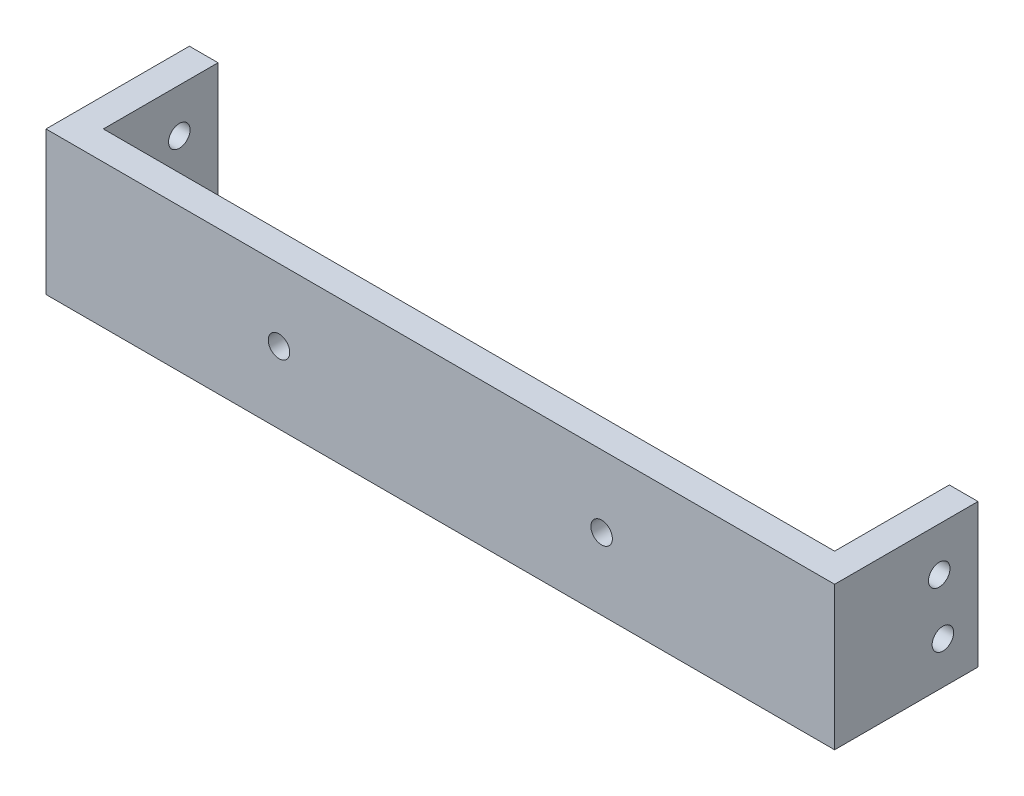
ISO-10303-21;
HEADER;
FILE_DESCRIPTION(('STEP AP214'),'2;1');
FILE_NAME('part.step','',(''),(''),'','','');
FILE_SCHEMA(('AUTOMOTIVE_DESIGN { 1 0 10303 214 1 1 1 1 }'));
ENDSEC;
DATA;
#1=APPLICATION_CONTEXT('core data for automotive mechanical design processes');
#2=APPLICATION_PROTOCOL_DEFINITION('international standard','automotive_design',2000,#1);
#3=PRODUCT_CONTEXT('',#1,'mechanical');
#4=PRODUCT('Part','Part','',(#3));
#5=PRODUCT_RELATED_PRODUCT_CATEGORY('part','',(#4));
#6=PRODUCT_DEFINITION_FORMATION('','',#4);
#7=PRODUCT_DEFINITION_CONTEXT('part definition',#1,'design');
#8=PRODUCT_DEFINITION('design','',#6,#7);
#9=PRODUCT_DEFINITION_SHAPE('','',#8);
#10=(LENGTH_UNIT() NAMED_UNIT(*) SI_UNIT(.MILLI.,.METRE.));
#11=(NAMED_UNIT(*) PLANE_ANGLE_UNIT() SI_UNIT($,.RADIAN.));
#12=(NAMED_UNIT(*) SI_UNIT($,.STERADIAN.) SOLID_ANGLE_UNIT());
#13=UNCERTAINTY_MEASURE_WITH_UNIT(LENGTH_MEASURE(1.E-05),#10,'distance_accuracy_value','');
#14=(GEOMETRIC_REPRESENTATION_CONTEXT(3) GLOBAL_UNCERTAINTY_ASSIGNED_CONTEXT((#13)) GLOBAL_UNIT_ASSIGNED_CONTEXT((#10,
#11,#12)) REPRESENTATION_CONTEXT('',''));
#15=CARTESIAN_POINT('',(0.,0.,0.));
#16=DIRECTION('',(0.,0.,1.));
#17=DIRECTION('',(1.,0.,0.));
#18=AXIS2_PLACEMENT_3D('',#15,#16,#17);
#19=CARTESIAN_POINT('',(55.,20.,0.));
#20=DIRECTION('',(1.,0.,0.));
#21=DIRECTION('',(0.,0.,-1.));
#22=AXIS2_PLACEMENT_3D('',#19,#20,#21);
#23=PLANE('',#22);
#24=CARTESIAN_POINT('',(55.,13.8673052898988,-12.5936105145427));
#25=DIRECTION('',(1.,0.,0.));
#26=DIRECTION('',(0.,0.,-1.));
#27=AXIS2_PLACEMENT_3D('',#24,#25,#26);
#28=CIRCLE('',#27,1.5);
#29=CARTESIAN_POINT('',(55.,13.8673052898988,-14.0936105145427));
#30=VERTEX_POINT('',#29);
#31=EDGE_CURVE('E198',#30,#30,#28,.T.);
#32=ORIENTED_EDGE('',*,*,#31,.F.);
#33=EDGE_LOOP('',(#32));
#34=FACE_BOUND('',#33,.T.);
#35=CARTESIAN_POINT('',(55.,5.88298190514036,-13.1039878477571));
#36=DIRECTION('',(1.,0.,0.));
#37=DIRECTION('',(0.,0.,-1.));
#38=AXIS2_PLACEMENT_3D('',#35,#36,#37);
#39=CIRCLE('',#38,1.5);
#40=CARTESIAN_POINT('',(55.,5.88298190514036,-14.6039878477571));
#41=VERTEX_POINT('',#40);
#42=EDGE_CURVE('E191',#41,#41,#39,.T.);
#43=ORIENTED_EDGE('',*,*,#42,.F.);
#44=EDGE_LOOP('',(#43));
#45=FACE_BOUND('',#44,.T.);
#46=DIRECTION('',(0.,0.,1.));
#47=VECTOR('',#46,1.);
#48=CARTESIAN_POINT('',(55.,0.,0.));
#49=LINE('',#48,#47);
#50=CARTESIAN_POINT('',(55.,0.,-18.));
#51=VERTEX_POINT('',#50);
#52=CARTESIAN_POINT('',(55.,0.,2.));
#53=VERTEX_POINT('',#52);
#54=EDGE_CURVE('E130',#51,#53,#49,.T.);
#55=ORIENTED_EDGE('',*,*,#54,.F.);
#56=DIRECTION('',(0.,-1.,0.));
#57=VECTOR('',#56,1.);
#58=CARTESIAN_POINT('',(55.,20.,-18.));
#59=LINE('',#58,#57);
#60=CARTESIAN_POINT('',(55.,20.,-18.));
#61=VERTEX_POINT('',#60);
#62=EDGE_CURVE('E11',#61,#51,#59,.T.);
#63=ORIENTED_EDGE('',*,*,#62,.F.);
#64=DIRECTION('',(0.,0.,1.));
#65=VECTOR('',#64,1.);
#66=CARTESIAN_POINT('',(55.,20.,0.));
#67=LINE('',#66,#65);
#68=CARTESIAN_POINT('',(55.,20.,2.));
#69=VERTEX_POINT('',#68);
#70=EDGE_CURVE('E150',#61,#69,#67,.T.);
#71=ORIENTED_EDGE('',*,*,#70,.T.);
#72=DIRECTION('',(0.,-1.,0.));
#73=VECTOR('',#72,1.);
#74=CARTESIAN_POINT('',(55.,20.,2.));
#75=LINE('',#74,#73);
#76=EDGE_CURVE('E85',#69,#53,#75,.T.);
#77=ORIENTED_EDGE('',*,*,#76,.T.);
#78=EDGE_LOOP('',(#55,#63,#71,#77));
#79=FACE_BOUND('',#78,.T.);
#80=ADVANCED_FACE('F35',(#34,#45,#79),#23,.T.);
#81=CARTESIAN_POINT('',(0.,20.,-18.));
#82=DIRECTION('',(0.,0.,1.));
#83=DIRECTION('',(1.,0.,0.));
#84=AXIS2_PLACEMENT_3D('',#81,#82,#83);
#85=PLANE('',#84);
#86=DIRECTION('',(-1.,0.,0.));
#87=VECTOR('',#86,1.);
#88=CARTESIAN_POINT('',(0.,0.,-18.));
#89=LINE('',#88,#87);
#90=CARTESIAN_POINT('',(51.,0.,-18.));
#91=VERTEX_POINT('',#90);
#92=EDGE_CURVE('E133',#51,#91,#89,.T.);
#93=ORIENTED_EDGE('',*,*,#92,.T.);
#94=DIRECTION('',(0.,-1.,0.));
#95=VECTOR('',#94,1.);
#96=CARTESIAN_POINT('',(51.,20.,-18.));
#97=LINE('',#96,#95);
#98=CARTESIAN_POINT('',(51.,20.,-18.));
#99=VERTEX_POINT('',#98);
#100=EDGE_CURVE('E43',#99,#91,#97,.T.);
#101=ORIENTED_EDGE('',*,*,#100,.F.);
#102=DIRECTION('',(-1.,0.,0.));
#103=VECTOR('',#102,1.);
#104=CARTESIAN_POINT('',(0.,20.,-18.));
#105=LINE('',#104,#103);
#106=EDGE_CURVE('E174',#61,#99,#105,.T.);
#107=ORIENTED_EDGE('',*,*,#106,.F.);
#108=ORIENTED_EDGE('',*,*,#62,.T.);
#109=EDGE_LOOP('',(#93,#101,#107,#108));
#110=FACE_BOUND('',#109,.T.);
#111=ADVANCED_FACE('F166',(#110),#85,.F.);
#112=CARTESIAN_POINT('',(51.,20.,0.));
#113=DIRECTION('',(-1.,0.,0.));
#114=DIRECTION('',(0.,0.,1.));
#115=AXIS2_PLACEMENT_3D('',#112,#113,#114);
#116=PLANE('',#115);
#117=CARTESIAN_POINT('',(51.,13.8673052898988,-12.5936105145427));
#118=DIRECTION('',(-1.,0.,0.));
#119=DIRECTION('',(0.,0.,1.));
#120=AXIS2_PLACEMENT_3D('',#117,#118,#119);
#121=CIRCLE('',#120,1.5);
#122=CARTESIAN_POINT('',(51.,13.8673052898988,-11.0936105145427));
#123=VERTEX_POINT('',#122);
#124=EDGE_CURVE('E134',#123,#123,#121,.T.);
#125=ORIENTED_EDGE('',*,*,#124,.F.);
#126=EDGE_LOOP('',(#125));
#127=FACE_BOUND('',#126,.T.);
#128=CARTESIAN_POINT('',(51.,5.88298190514036,-13.1039878477571));
#129=DIRECTION('',(-1.,0.,0.));
#130=DIRECTION('',(0.,0.,1.));
#131=AXIS2_PLACEMENT_3D('',#128,#129,#130);
#132=CIRCLE('',#131,1.5);
#133=CARTESIAN_POINT('',(51.,5.88298190514036,-11.6039878477571));
#134=VERTEX_POINT('',#133);
#135=EDGE_CURVE('E184',#134,#134,#132,.T.);
#136=ORIENTED_EDGE('',*,*,#135,.F.);
#137=EDGE_LOOP('',(#136));
#138=FACE_BOUND('',#137,.T.);
#139=DIRECTION('',(0.,0.,-1.));
#140=VECTOR('',#139,1.);
#141=CARTESIAN_POINT('',(51.,0.,0.));
#142=LINE('',#141,#140);
#143=CARTESIAN_POINT('',(51.,0.,-2.));
#144=VERTEX_POINT('',#143);
#145=EDGE_CURVE('E137',#144,#91,#142,.T.);
#146=ORIENTED_EDGE('',*,*,#145,.F.);
#147=DIRECTION('',(0.,-1.,0.));
#148=VECTOR('',#147,1.);
#149=CARTESIAN_POINT('',(51.,20.,-2.));
#150=LINE('',#149,#148);
#151=CARTESIAN_POINT('',(51.,20.,-2.));
#152=VERTEX_POINT('',#151);
#153=EDGE_CURVE('E156',#152,#144,#150,.T.);
#154=ORIENTED_EDGE('',*,*,#153,.F.);
#155=DIRECTION('',(0.,0.,-1.));
#156=VECTOR('',#155,1.);
#157=CARTESIAN_POINT('',(51.,20.,0.));
#158=LINE('',#157,#156);
#159=EDGE_CURVE('E163',#152,#99,#158,.T.);
#160=ORIENTED_EDGE('',*,*,#159,.T.);
#161=ORIENTED_EDGE('',*,*,#100,.T.);
#162=EDGE_LOOP('',(#146,#154,#160,#161));
#163=FACE_BOUND('',#162,.T.);
#164=ADVANCED_FACE('F161',(#127,#138,#163),#116,.T.);
#165=CARTESIAN_POINT('',(0.,20.,-2.));
#166=DIRECTION('',(0.,0.,-1.));
#167=DIRECTION('',(-1.,0.,0.));
#168=AXIS2_PLACEMENT_3D('',#165,#166,#167);
#169=PLANE('',#168);
#170=CARTESIAN_POINT('',(22.5,10.,-2.));
#171=DIRECTION('',(0.,0.,-1.));
#172=DIRECTION('',(-1.,0.,0.));
#173=AXIS2_PLACEMENT_3D('',#170,#171,#172);
#174=CIRCLE('',#173,1.5);
#175=CARTESIAN_POINT('',(21.,10.,-2.));
#176=VERTEX_POINT('',#175);
#177=EDGE_CURVE('E195',#176,#176,#174,.T.);
#178=ORIENTED_EDGE('',*,*,#177,.F.);
#179=EDGE_LOOP('',(#178));
#180=FACE_BOUND('',#179,.T.);
#181=CARTESIAN_POINT('',(-22.5,10.,-2.));
#182=DIRECTION('',(0.,0.,-1.));
#183=DIRECTION('',(-1.,0.,0.));
#184=AXIS2_PLACEMENT_3D('',#181,#182,#183);
#185=CIRCLE('',#184,1.5);
#186=CARTESIAN_POINT('',(-24.,10.,-2.));
#187=VERTEX_POINT('',#186);
#188=EDGE_CURVE('E205',#187,#187,#185,.T.);
#189=ORIENTED_EDGE('',*,*,#188,.F.);
#190=EDGE_LOOP('',(#189));
#191=FACE_BOUND('',#190,.T.);
#192=DIRECTION('',(1.,0.,0.));
#193=VECTOR('',#192,1.);
#194=CARTESIAN_POINT('',(0.,0.,-2.));
#195=LINE('',#194,#193);
#196=CARTESIAN_POINT('',(-51.,0.,-2.));
#197=VERTEX_POINT('',#196);
#198=EDGE_CURVE('E140',#197,#144,#195,.T.);
#199=ORIENTED_EDGE('',*,*,#198,.F.);
#200=DIRECTION('',(0.,-1.,0.));
#201=VECTOR('',#200,1.);
#202=CARTESIAN_POINT('',(-51.,20.,-2.));
#203=LINE('',#202,#201);
#204=CARTESIAN_POINT('',(-51.,20.,-2.));
#205=VERTEX_POINT('',#204);
#206=EDGE_CURVE('E154',#205,#197,#203,.T.);
#207=ORIENTED_EDGE('',*,*,#206,.F.);
#208=DIRECTION('',(1.,0.,0.));
#209=VECTOR('',#208,1.);
#210=CARTESIAN_POINT('',(0.,20.,-2.));
#211=LINE('',#210,#209);
#212=EDGE_CURVE('E125',#205,#152,#211,.T.);
#213=ORIENTED_EDGE('',*,*,#212,.T.);
#214=ORIENTED_EDGE('',*,*,#153,.T.);
#215=EDGE_LOOP('',(#199,#207,#213,#214));
#216=FACE_BOUND('',#215,.T.);
#217=ADVANCED_FACE('F172',(#180,#191,#216),#169,.T.);
#218=CARTESIAN_POINT('',(-51.,20.,0.));
#219=DIRECTION('',(-1.,0.,0.));
#220=DIRECTION('',(0.,0.,1.));
#221=AXIS2_PLACEMENT_3D('',#218,#219,#220);
#222=PLANE('',#221);
#223=CARTESIAN_POINT('',(-51.,13.8673052898988,-12.5936105145427));
#224=DIRECTION('',(-1.,0.,0.));
#225=DIRECTION('',(0.,0.,1.));
#226=AXIS2_PLACEMENT_3D('',#223,#224,#225);
#227=CIRCLE('',#226,1.5);
#228=CARTESIAN_POINT('',(-51.,13.8673052898988,-11.0936105145427));
#229=VERTEX_POINT('',#228);
#230=EDGE_CURVE('E181',#229,#229,#227,.T.);
#231=ORIENTED_EDGE('',*,*,#230,.T.);
#232=EDGE_LOOP('',(#231));
#233=FACE_BOUND('',#232,.T.);
#234=CARTESIAN_POINT('',(-51.,5.88298190514036,-13.1039878477571));
#235=DIRECTION('',(-1.,0.,0.));
#236=DIRECTION('',(0.,0.,1.));
#237=AXIS2_PLACEMENT_3D('',#234,#235,#236);
#238=CIRCLE('',#237,1.5);
#239=CARTESIAN_POINT('',(-51.,5.88298190514036,-11.6039878477571));
#240=VERTEX_POINT('',#239);
#241=EDGE_CURVE('E187',#240,#240,#238,.T.);
#242=ORIENTED_EDGE('',*,*,#241,.T.);
#243=EDGE_LOOP('',(#242));
#244=FACE_BOUND('',#243,.T.);
#245=DIRECTION('',(0.,0.,-1.));
#246=VECTOR('',#245,1.);
#247=CARTESIAN_POINT('',(-51.,0.,0.));
#248=LINE('',#247,#246);
#249=CARTESIAN_POINT('',(-51.,0.,-18.));
#250=VERTEX_POINT('',#249);
#251=EDGE_CURVE('E143',#197,#250,#248,.T.);
#252=ORIENTED_EDGE('',*,*,#251,.T.);
#253=DIRECTION('',(0.,-1.,0.));
#254=VECTOR('',#253,1.);
#255=CARTESIAN_POINT('',(-51.,20.,-18.));
#256=LINE('',#255,#254);
#257=CARTESIAN_POINT('',(-51.,20.,-18.));
#258=VERTEX_POINT('',#257);
#259=EDGE_CURVE('E113',#258,#250,#256,.T.);
#260=ORIENTED_EDGE('',*,*,#259,.F.);
#261=DIRECTION('',(0.,0.,-1.));
#262=VECTOR('',#261,1.);
#263=CARTESIAN_POINT('',(-51.,20.,0.));
#264=LINE('',#263,#262);
#265=EDGE_CURVE('E122',#205,#258,#264,.T.);
#266=ORIENTED_EDGE('',*,*,#265,.F.);
#267=ORIENTED_EDGE('',*,*,#206,.T.);
#268=EDGE_LOOP('',(#252,#260,#266,#267));
#269=FACE_BOUND('',#268,.T.);
#270=ADVANCED_FACE('F259',(#233,#244,#269),#222,.F.);
#271=CARTESIAN_POINT('',(0.,20.,-18.));
#272=DIRECTION('',(0.,0.,-1.));
#273=DIRECTION('',(-1.,0.,0.));
#274=AXIS2_PLACEMENT_3D('',#271,#272,#273);
#275=PLANE('',#274);
#276=DIRECTION('',(1.,0.,0.));
#277=VECTOR('',#276,1.);
#278=CARTESIAN_POINT('',(0.,0.,-18.));
#279=LINE('',#278,#277);
#280=CARTESIAN_POINT('',(-55.,0.,-18.));
#281=VERTEX_POINT('',#280);
#282=EDGE_CURVE('E112',#281,#250,#279,.T.);
#283=ORIENTED_EDGE('',*,*,#282,.F.);
#284=DIRECTION('',(0.,-1.,0.));
#285=VECTOR('',#284,1.);
#286=CARTESIAN_POINT('',(-55.,20.,-18.));
#287=LINE('',#286,#285);
#288=CARTESIAN_POINT('',(-55.,20.,-18.));
#289=VERTEX_POINT('',#288);
#290=EDGE_CURVE('E106',#289,#281,#287,.T.);
#291=ORIENTED_EDGE('',*,*,#290,.F.);
#292=DIRECTION('',(1.,0.,0.));
#293=VECTOR('',#292,1.);
#294=CARTESIAN_POINT('',(0.,20.,-18.));
#295=LINE('',#294,#293);
#296=EDGE_CURVE('E110',#289,#258,#295,.T.);
#297=ORIENTED_EDGE('',*,*,#296,.T.);
#298=ORIENTED_EDGE('',*,*,#259,.T.);
#299=EDGE_LOOP('',(#283,#291,#297,#298));
#300=FACE_BOUND('',#299,.T.);
#301=ADVANCED_FACE('F108',(#300),#275,.T.);
#302=CARTESIAN_POINT('',(-55.,20.,0.));
#303=DIRECTION('',(1.,0.,0.));
#304=DIRECTION('',(0.,0.,-1.));
#305=AXIS2_PLACEMENT_3D('',#302,#303,#304);
#306=PLANE('',#305);
#307=CARTESIAN_POINT('',(-55.,13.8673052898988,-12.5936105145427));
#308=DIRECTION('',(1.,0.,0.));
#309=DIRECTION('',(0.,0.,-1.));
#310=AXIS2_PLACEMENT_3D('',#307,#308,#309);
#311=CIRCLE('',#310,1.5);
#312=CARTESIAN_POINT('',(-55.,13.8673052898988,-14.0936105145427));
#313=VERTEX_POINT('',#312);
#314=EDGE_CURVE('E190',#313,#313,#311,.T.);
#315=ORIENTED_EDGE('',*,*,#314,.T.);
#316=EDGE_LOOP('',(#315));
#317=FACE_BOUND('',#316,.T.);
#318=CARTESIAN_POINT('',(-55.,5.88298190514036,-13.1039878477571));
#319=DIRECTION('',(1.,0.,0.));
#320=DIRECTION('',(0.,0.,-1.));
#321=AXIS2_PLACEMENT_3D('',#318,#319,#320);
#322=CIRCLE('',#321,1.5);
#323=CARTESIAN_POINT('',(-55.,5.88298190514036,-14.6039878477571));
#324=VERTEX_POINT('',#323);
#325=EDGE_CURVE('E194',#324,#324,#322,.T.);
#326=ORIENTED_EDGE('',*,*,#325,.T.);
#327=EDGE_LOOP('',(#326));
#328=FACE_BOUND('',#327,.T.);
#329=DIRECTION('',(0.,0.,1.));
#330=VECTOR('',#329,1.);
#331=CARTESIAN_POINT('',(-55.,0.,0.));
#332=LINE('',#331,#330);
#333=CARTESIAN_POINT('',(-55.,0.,2.));
#334=VERTEX_POINT('',#333);
#335=EDGE_CURVE('E78',#281,#334,#332,.T.);
#336=ORIENTED_EDGE('',*,*,#335,.T.);
#337=DIRECTION('',(0.,-1.,0.));
#338=VECTOR('',#337,1.);
#339=CARTESIAN_POINT('',(-55.,20.,2.));
#340=LINE('',#339,#338);
#341=CARTESIAN_POINT('',(-55.,20.,2.));
#342=VERTEX_POINT('',#341);
#343=EDGE_CURVE('E114',#342,#334,#340,.T.);
#344=ORIENTED_EDGE('',*,*,#343,.F.);
#345=DIRECTION('',(0.,0.,1.));
#346=VECTOR('',#345,1.);
#347=CARTESIAN_POINT('',(-55.,20.,0.));
#348=LINE('',#347,#346);
#349=EDGE_CURVE('E116',#289,#342,#348,.T.);
#350=ORIENTED_EDGE('',*,*,#349,.F.);
#351=ORIENTED_EDGE('',*,*,#290,.T.);
#352=EDGE_LOOP('',(#336,#344,#350,#351));
#353=FACE_BOUND('',#352,.T.);
#354=ADVANCED_FACE('F117',(#317,#328,#353),#306,.F.);
#355=CARTESIAN_POINT('',(0.,20.,2.));
#356=DIRECTION('',(0.,0.,-1.));
#357=DIRECTION('',(-1.,0.,0.));
#358=AXIS2_PLACEMENT_3D('',#355,#356,#357);
#359=PLANE('',#358);
#360=CARTESIAN_POINT('',(22.5,10.,2.));
#361=DIRECTION('',(0.,0.,1.));
#362=DIRECTION('',(1.,0.,0.));
#363=AXIS2_PLACEMENT_3D('',#360,#361,#362);
#364=CIRCLE('',#363,1.5);
#365=CARTESIAN_POINT('',(24.,10.,2.));
#366=VERTEX_POINT('',#365);
#367=EDGE_CURVE('E208',#366,#366,#364,.T.);
#368=ORIENTED_EDGE('',*,*,#367,.F.);
#369=EDGE_LOOP('',(#368));
#370=FACE_BOUND('',#369,.T.);
#371=CARTESIAN_POINT('',(-22.5,10.,2.));
#372=DIRECTION('',(0.,0.,1.));
#373=DIRECTION('',(1.,0.,0.));
#374=AXIS2_PLACEMENT_3D('',#371,#372,#373);
#375=CIRCLE('',#374,1.5);
#376=CARTESIAN_POINT('',(-21.,10.,2.));
#377=VERTEX_POINT('',#376);
#378=EDGE_CURVE('E209',#377,#377,#375,.T.);
#379=ORIENTED_EDGE('',*,*,#378,.F.);
#380=EDGE_LOOP('',(#379));
#381=FACE_BOUND('',#380,.T.);
#382=DIRECTION('',(1.,0.,0.));
#383=VECTOR('',#382,1.);
#384=CARTESIAN_POINT('',(0.,0.,2.));
#385=LINE('',#384,#383);
#386=EDGE_CURVE('E148',#334,#53,#385,.T.);
#387=ORIENTED_EDGE('',*,*,#386,.T.);
#388=ORIENTED_EDGE('',*,*,#76,.F.);
#389=DIRECTION('',(1.,0.,0.));
#390=VECTOR('',#389,1.);
#391=CARTESIAN_POINT('',(0.,20.,2.));
#392=LINE('',#391,#390);
#393=EDGE_CURVE('E51',#342,#69,#392,.T.);
#394=ORIENTED_EDGE('',*,*,#393,.F.);
#395=ORIENTED_EDGE('',*,*,#343,.T.);
#396=EDGE_LOOP('',(#387,#388,#394,#395));
#397=FACE_BOUND('',#396,.T.);
#398=ADVANCED_FACE('F217',(#370,#381,#397),#359,.F.);
#399=CARTESIAN_POINT('',(0.,20.,0.));
#400=DIRECTION('',(0.,1.,0.));
#401=DIRECTION('',(0.,0.,1.));
#402=AXIS2_PLACEMENT_3D('',#399,#400,#401);
#403=PLANE('',#402);
#404=ORIENTED_EDGE('',*,*,#70,.F.);
#405=ORIENTED_EDGE('',*,*,#106,.T.);
#406=ORIENTED_EDGE('',*,*,#159,.F.);
#407=ORIENTED_EDGE('',*,*,#212,.F.);
#408=ORIENTED_EDGE('',*,*,#265,.T.);
#409=ORIENTED_EDGE('',*,*,#296,.F.);
#410=ORIENTED_EDGE('',*,*,#349,.T.);
#411=ORIENTED_EDGE('',*,*,#393,.T.);
#412=EDGE_LOOP('',(#404,#405,#406,#407,#408,#409,#410,#411));
#413=FACE_BOUND('',#412,.T.);
#414=ADVANCED_FACE('F119',(#413),#403,.T.);
#415=CARTESIAN_POINT('',(0.,0.,0.));
#416=DIRECTION('',(0.,1.,0.));
#417=DIRECTION('',(0.,0.,1.));
#418=AXIS2_PLACEMENT_3D('',#415,#416,#417);
#419=PLANE('',#418);
#420=ORIENTED_EDGE('',*,*,#54,.T.);
#421=ORIENTED_EDGE('',*,*,#386,.F.);
#422=ORIENTED_EDGE('',*,*,#335,.F.);
#423=ORIENTED_EDGE('',*,*,#282,.T.);
#424=ORIENTED_EDGE('',*,*,#251,.F.);
#425=ORIENTED_EDGE('',*,*,#198,.T.);
#426=ORIENTED_EDGE('',*,*,#145,.T.);
#427=ORIENTED_EDGE('',*,*,#92,.F.);
#428=EDGE_LOOP('',(#420,#421,#422,#423,#424,#425,#426,#427));
#429=FACE_BOUND('',#428,.T.);
#430=ADVANCED_FACE('F168',(#429),#419,.F.);
#431=CARTESIAN_POINT('',(-55.,5.88298190514036,-13.1039878477571));
#432=DIRECTION('',(1.,0.,0.));
#433=DIRECTION('',(0.,0.,-1.));
#434=AXIS2_PLACEMENT_3D('',#431,#432,#433);
#435=CYLINDRICAL_SURFACE('',#434,1.5);
#436=ORIENTED_EDGE('',*,*,#325,.F.);
#437=EDGE_LOOP('',(#436));
#438=FACE_BOUND('',#437,.T.);
#439=ORIENTED_EDGE('',*,*,#241,.F.);
#440=EDGE_LOOP('',(#439));
#441=FACE_BOUND('',#440,.T.);
#442=ADVANCED_FACE('F239',(#438,#441),#435,.F.);
#443=CARTESIAN_POINT('',(-55.,13.8673052898988,-12.5936105145427));
#444=DIRECTION('',(1.,0.,0.));
#445=DIRECTION('',(0.,0.,-1.));
#446=AXIS2_PLACEMENT_3D('',#443,#444,#445);
#447=CYLINDRICAL_SURFACE('',#446,1.5);
#448=ORIENTED_EDGE('',*,*,#314,.F.);
#449=EDGE_LOOP('',(#448));
#450=FACE_BOUND('',#449,.T.);
#451=ORIENTED_EDGE('',*,*,#230,.F.);
#452=EDGE_LOOP('',(#451));
#453=FACE_BOUND('',#452,.T.);
#454=ADVANCED_FACE('F236',(#450,#453),#447,.F.);
#455=ORIENTED_EDGE('',*,*,#135,.T.);
#456=EDGE_LOOP('',(#455));
#457=FACE_BOUND('',#456,.T.);
#458=ORIENTED_EDGE('',*,*,#42,.T.);
#459=EDGE_LOOP('',(#458));
#460=FACE_BOUND('',#459,.T.);
#461=ADVANCED_FACE('F233',(#457,#460),#435,.F.);
#462=ORIENTED_EDGE('',*,*,#124,.T.);
#463=EDGE_LOOP('',(#462));
#464=FACE_BOUND('',#463,.T.);
#465=ORIENTED_EDGE('',*,*,#31,.T.);
#466=EDGE_LOOP('',(#465));
#467=FACE_BOUND('',#466,.T.);
#468=ADVANCED_FACE('F235',(#464,#467),#447,.F.);
#469=CARTESIAN_POINT('',(-22.5,10.,-18.));
#470=DIRECTION('',(0.,0.,1.));
#471=DIRECTION('',(1.,0.,0.));
#472=AXIS2_PLACEMENT_3D('',#469,#470,#471);
#473=CYLINDRICAL_SURFACE('',#472,1.5);
#474=ORIENTED_EDGE('',*,*,#188,.T.);
#475=EDGE_LOOP('',(#474));
#476=FACE_BOUND('',#475,.T.);
#477=ORIENTED_EDGE('',*,*,#378,.T.);
#478=EDGE_LOOP('',(#477));
#479=FACE_BOUND('',#478,.T.);
#480=ADVANCED_FACE('F244',(#476,#479),#473,.F.);
#481=CARTESIAN_POINT('',(22.5,10.,-18.));
#482=DIRECTION('',(0.,0.,1.));
#483=DIRECTION('',(1.,0.,0.));
#484=AXIS2_PLACEMENT_3D('',#481,#482,#483);
#485=CYLINDRICAL_SURFACE('',#484,1.5);
#486=ORIENTED_EDGE('',*,*,#177,.T.);
#487=EDGE_LOOP('',(#486));
#488=FACE_BOUND('',#487,.T.);
#489=ORIENTED_EDGE('',*,*,#367,.T.);
#490=EDGE_LOOP('',(#489));
#491=FACE_BOUND('',#490,.T.);
#492=ADVANCED_FACE('F215',(#488,#491),#485,.F.);
#493=CLOSED_SHELL('',(#80,#111,#164,#217,#270,#301,#354,#398,#414,#430,#442,#454,#461,#468,#480,#492));
#494=MANIFOLD_SOLID_BREP('B2',#493);
#495=ADVANCED_BREP_SHAPE_REPRESENTATION('',(#18,#494),#14);
#496=SHAPE_DEFINITION_REPRESENTATION(#9,#495);
ENDSEC;
END-ISO-10303-21;
